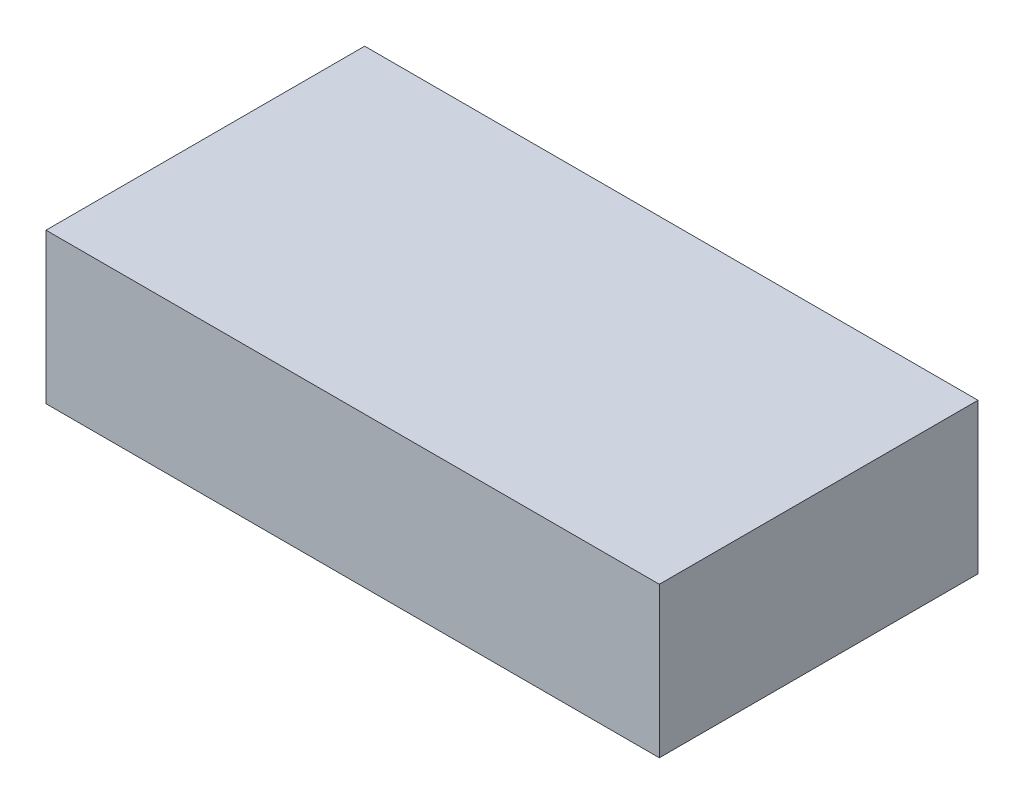
ISO-10303-21;
HEADER;
FILE_DESCRIPTION(('STEP AP214'),'2;1');
FILE_NAME('part.step','',(''),(''),'','','');
FILE_SCHEMA(('AUTOMOTIVE_DESIGN { 1 0 10303 214 1 1 1 1 }'));
ENDSEC;
DATA;
#1=APPLICATION_CONTEXT('core data for automotive mechanical design processes');
#2=APPLICATION_PROTOCOL_DEFINITION('international standard','automotive_design',2000,#1);
#3=PRODUCT_CONTEXT('',#1,'mechanical');
#4=PRODUCT('Part','Part','',(#3));
#5=PRODUCT_RELATED_PRODUCT_CATEGORY('part','',(#4));
#6=PRODUCT_DEFINITION_FORMATION('','',#4);
#7=PRODUCT_DEFINITION_CONTEXT('part definition',#1,'design');
#8=PRODUCT_DEFINITION('design','',#6,#7);
#9=PRODUCT_DEFINITION_SHAPE('','',#8);
#10=(LENGTH_UNIT() NAMED_UNIT(*) SI_UNIT(.MILLI.,.METRE.));
#11=(NAMED_UNIT(*) PLANE_ANGLE_UNIT() SI_UNIT($,.RADIAN.));
#12=(NAMED_UNIT(*) SI_UNIT($,.STERADIAN.) SOLID_ANGLE_UNIT());
#13=UNCERTAINTY_MEASURE_WITH_UNIT(LENGTH_MEASURE(1.E-05),#10,'distance_accuracy_value','');
#14=(GEOMETRIC_REPRESENTATION_CONTEXT(3) GLOBAL_UNCERTAINTY_ASSIGNED_CONTEXT((#13)) GLOBAL_UNIT_ASSIGNED_CONTEXT((#10,
#11,#12)) REPRESENTATION_CONTEXT('',''));
#15=CARTESIAN_POINT('',(0.,0.,0.));
#16=DIRECTION('',(0.,0.,1.));
#17=DIRECTION('',(1.,0.,0.));
#18=AXIS2_PLACEMENT_3D('',#15,#16,#17);
#19=CARTESIAN_POINT('',(51.,25.,26.5));
#20=DIRECTION('',(-1.,0.,0.));
#21=DIRECTION('',(0.,0.,1.));
#22=AXIS2_PLACEMENT_3D('',#19,#20,#21);
#23=PLANE('',#22);
#24=DIRECTION('',(0.,0.,-1.));
#25=VECTOR('',#24,1.);
#26=CARTESIAN_POINT('',(51.,0.,26.5));
#27=LINE('',#26,#25);
#28=CARTESIAN_POINT('',(51.,0.,26.5));
#29=VERTEX_POINT('',#28);
#30=CARTESIAN_POINT('',(51.,0.,-26.5));
#31=VERTEX_POINT('',#30);
#32=EDGE_CURVE('E95',#29,#31,#27,.T.);
#33=ORIENTED_EDGE('',*,*,#32,.T.);
#34=DIRECTION('',(0.,-1.,0.));
#35=VECTOR('',#34,1.);
#36=CARTESIAN_POINT('',(51.,25.,-26.5));
#37=LINE('',#36,#35);
#38=CARTESIAN_POINT('',(51.,25.,-26.5));
#39=VERTEX_POINT('',#38);
#40=EDGE_CURVE('E11',#39,#31,#37,.T.);
#41=ORIENTED_EDGE('',*,*,#40,.F.);
#42=DIRECTION('',(0.,0.,-1.));
#43=VECTOR('',#42,1.);
#44=CARTESIAN_POINT('',(51.,25.,26.5));
#45=LINE('',#44,#43);
#46=CARTESIAN_POINT('',(51.,25.,26.5));
#47=VERTEX_POINT('',#46);
#48=EDGE_CURVE('E83',#47,#39,#45,.T.);
#49=ORIENTED_EDGE('',*,*,#48,.F.);
#50=DIRECTION('',(0.,-1.,0.));
#51=VECTOR('',#50,1.);
#52=CARTESIAN_POINT('',(51.,25.,26.5));
#53=LINE('',#52,#51);
#54=EDGE_CURVE('E91',#47,#29,#53,.T.);
#55=ORIENTED_EDGE('',*,*,#54,.T.);
#56=EDGE_LOOP('',(#33,#41,#49,#55));
#57=FACE_BOUND('',#56,.T.);
#58=ADVANCED_FACE('F32',(#57),#23,.F.);
#59=CARTESIAN_POINT('',(-51.,25.,-26.5));
#60=DIRECTION('',(0.,0.,1.));
#61=DIRECTION('',(1.,0.,0.));
#62=AXIS2_PLACEMENT_3D('',#59,#60,#61);
#63=PLANE('',#62);
#64=DIRECTION('',(-1.,0.,0.));
#65=VECTOR('',#64,1.);
#66=CARTESIAN_POINT('',(-51.,0.,-26.5));
#67=LINE('',#66,#65);
#68=CARTESIAN_POINT('',(-51.,0.,-26.5));
#69=VERTEX_POINT('',#68);
#70=EDGE_CURVE('E87',#31,#69,#67,.T.);
#71=ORIENTED_EDGE('',*,*,#70,.T.);
#72=DIRECTION('',(0.,-1.,0.));
#73=VECTOR('',#72,1.);
#74=CARTESIAN_POINT('',(-51.,25.,-26.5));
#75=LINE('',#74,#73);
#76=CARTESIAN_POINT('',(-51.,25.,-26.5));
#77=VERTEX_POINT('',#76);
#78=EDGE_CURVE('E40',#77,#69,#75,.T.);
#79=ORIENTED_EDGE('',*,*,#78,.F.);
#80=DIRECTION('',(-1.,0.,0.));
#81=VECTOR('',#80,1.);
#82=CARTESIAN_POINT('',(-51.,25.,-26.5));
#83=LINE('',#82,#81);
#84=EDGE_CURVE('E78',#39,#77,#83,.T.);
#85=ORIENTED_EDGE('',*,*,#84,.F.);
#86=ORIENTED_EDGE('',*,*,#40,.T.);
#87=EDGE_LOOP('',(#71,#79,#85,#86));
#88=FACE_BOUND('',#87,.T.);
#89=ADVANCED_FACE('F86',(#88),#63,.F.);
#90=CARTESIAN_POINT('',(-51.,25.,26.5));
#91=DIRECTION('',(1.,0.,0.));
#92=DIRECTION('',(0.,0.,-1.));
#93=AXIS2_PLACEMENT_3D('',#90,#91,#92);
#94=PLANE('',#93);
#95=DIRECTION('',(0.,0.,1.));
#96=VECTOR('',#95,1.);
#97=CARTESIAN_POINT('',(-51.,0.,26.5));
#98=LINE('',#97,#96);
#99=CARTESIAN_POINT('',(-51.,0.,26.5));
#100=VERTEX_POINT('',#99);
#101=EDGE_CURVE('E65',#69,#100,#98,.T.);
#102=ORIENTED_EDGE('',*,*,#101,.T.);
#103=DIRECTION('',(0.,-1.,0.));
#104=VECTOR('',#103,1.);
#105=CARTESIAN_POINT('',(-51.,25.,26.5));
#106=LINE('',#105,#104);
#107=CARTESIAN_POINT('',(-51.,25.,26.5));
#108=VERTEX_POINT('',#107);
#109=EDGE_CURVE('E88',#108,#100,#106,.T.);
#110=ORIENTED_EDGE('',*,*,#109,.F.);
#111=DIRECTION('',(0.,0.,1.));
#112=VECTOR('',#111,1.);
#113=CARTESIAN_POINT('',(-51.,25.,26.5));
#114=LINE('',#113,#112);
#115=EDGE_CURVE('E81',#77,#108,#114,.T.);
#116=ORIENTED_EDGE('',*,*,#115,.F.);
#117=ORIENTED_EDGE('',*,*,#78,.T.);
#118=EDGE_LOOP('',(#102,#110,#116,#117));
#119=FACE_BOUND('',#118,.T.);
#120=ADVANCED_FACE('F89',(#119),#94,.F.);
#121=CARTESIAN_POINT('',(-51.,25.,26.5));
#122=DIRECTION('',(0.,0.,-1.));
#123=DIRECTION('',(-1.,0.,0.));
#124=AXIS2_PLACEMENT_3D('',#121,#122,#123);
#125=PLANE('',#124);
#126=DIRECTION('',(1.,0.,0.));
#127=VECTOR('',#126,1.);
#128=CARTESIAN_POINT('',(-51.,0.,26.5));
#129=LINE('',#128,#127);
#130=EDGE_CURVE('E71',#100,#29,#129,.T.);
#131=ORIENTED_EDGE('',*,*,#130,.T.);
#132=ORIENTED_EDGE('',*,*,#54,.F.);
#133=DIRECTION('',(1.,0.,0.));
#134=VECTOR('',#133,1.);
#135=CARTESIAN_POINT('',(-51.,25.,26.5));
#136=LINE('',#135,#134);
#137=EDGE_CURVE('E48',#108,#47,#136,.T.);
#138=ORIENTED_EDGE('',*,*,#137,.F.);
#139=ORIENTED_EDGE('',*,*,#109,.T.);
#140=EDGE_LOOP('',(#131,#132,#138,#139));
#141=FACE_BOUND('',#140,.T.);
#142=ADVANCED_FACE('F102',(#141),#125,.F.);
#143=CARTESIAN_POINT('',(0.,25.,0.));
#144=DIRECTION('',(0.,-1.,0.));
#145=DIRECTION('',(0.,0.,-1.));
#146=AXIS2_PLACEMENT_3D('',#143,#144,#145);
#147=PLANE('',#146);
#148=ORIENTED_EDGE('',*,*,#48,.T.);
#149=ORIENTED_EDGE('',*,*,#84,.T.);
#150=ORIENTED_EDGE('',*,*,#115,.T.);
#151=ORIENTED_EDGE('',*,*,#137,.T.);
#152=EDGE_LOOP('',(#148,#149,#150,#151));
#153=FACE_BOUND('',#152,.T.);
#154=ADVANCED_FACE('F79',(#153),#147,.F.);
#155=CARTESIAN_POINT('',(0.,0.,0.));
#156=DIRECTION('',(0.,-1.,0.));
#157=DIRECTION('',(0.,0.,-1.));
#158=AXIS2_PLACEMENT_3D('',#155,#156,#157);
#159=PLANE('',#158);
#160=ORIENTED_EDGE('',*,*,#32,.F.);
#161=ORIENTED_EDGE('',*,*,#130,.F.);
#162=ORIENTED_EDGE('',*,*,#101,.F.);
#163=ORIENTED_EDGE('',*,*,#70,.F.);
#164=EDGE_LOOP('',(#160,#161,#162,#163));
#165=FACE_BOUND('',#164,.T.);
#166=ADVANCED_FACE('F105',(#165),#159,.T.);
#167=CLOSED_SHELL('',(#58,#89,#120,#142,#154,#166));
#168=MANIFOLD_SOLID_BREP('B2',#167);
#169=ADVANCED_BREP_SHAPE_REPRESENTATION('',(#18,#168),#14);
#170=SHAPE_DEFINITION_REPRESENTATION(#9,#169);
ENDSEC;
END-ISO-10303-21;
